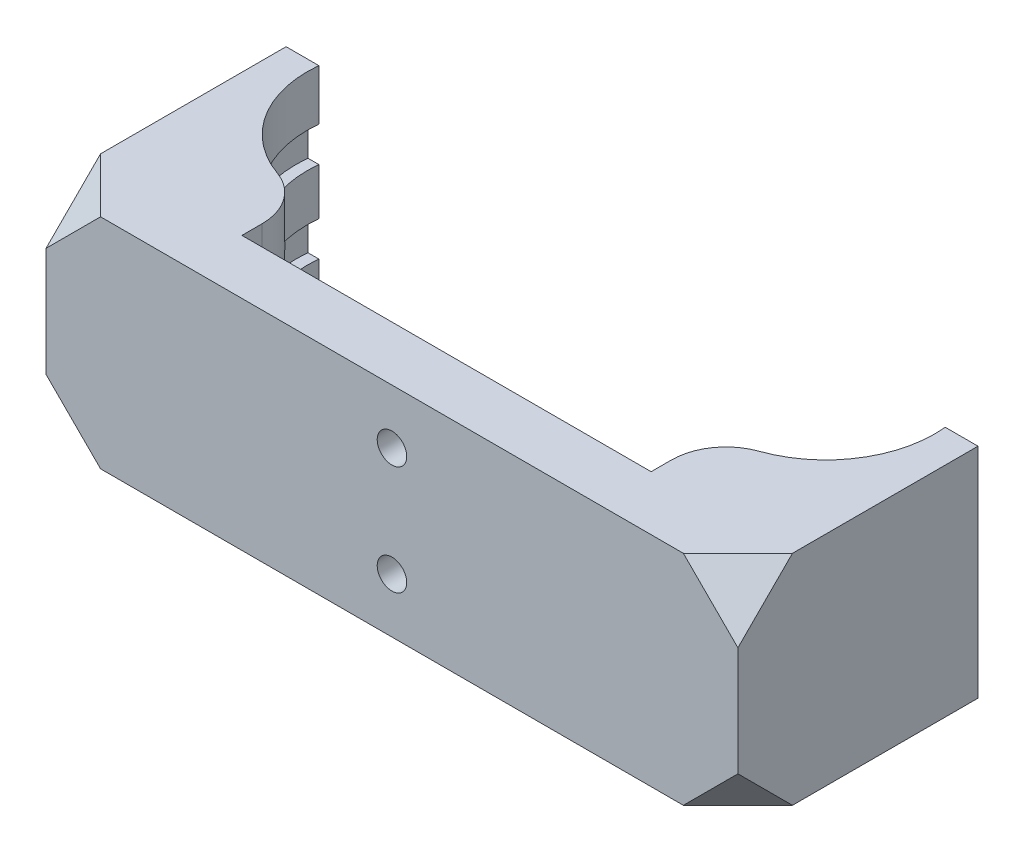
ISO-10303-21;
HEADER;
FILE_DESCRIPTION(('STEP AP214'),'2;1');
FILE_NAME('part.step','',(''),(''),'','','');
FILE_SCHEMA(('AUTOMOTIVE_DESIGN { 1 0 10303 214 1 1 1 1 }'));
ENDSEC;
DATA;
#1=APPLICATION_CONTEXT('core data for automotive mechanical design processes');
#2=APPLICATION_PROTOCOL_DEFINITION('international standard','automotive_design',2000,#1);
#3=PRODUCT_CONTEXT('',#1,'mechanical');
#4=PRODUCT('Part','Part','',(#3));
#5=PRODUCT_RELATED_PRODUCT_CATEGORY('part','',(#4));
#6=PRODUCT_DEFINITION_FORMATION('','',#4);
#7=PRODUCT_DEFINITION_CONTEXT('part definition',#1,'design');
#8=PRODUCT_DEFINITION('design','',#6,#7);
#9=PRODUCT_DEFINITION_SHAPE('','',#8);
#10=(LENGTH_UNIT() NAMED_UNIT(*) SI_UNIT(.MILLI.,.METRE.));
#11=(NAMED_UNIT(*) PLANE_ANGLE_UNIT() SI_UNIT($,.RADIAN.));
#12=(NAMED_UNIT(*) SI_UNIT($,.STERADIAN.) SOLID_ANGLE_UNIT());
#13=UNCERTAINTY_MEASURE_WITH_UNIT(LENGTH_MEASURE(1.E-05),#10,'distance_accuracy_value','');
#14=(GEOMETRIC_REPRESENTATION_CONTEXT(3) GLOBAL_UNCERTAINTY_ASSIGNED_CONTEXT((#13)) GLOBAL_UNIT_ASSIGNED_CONTEXT((#10,
#11,#12)) REPRESENTATION_CONTEXT('',''));
#15=CARTESIAN_POINT('',(0.,0.,0.));
#16=DIRECTION('',(0.,0.,1.));
#17=DIRECTION('',(1.,0.,0.));
#18=AXIS2_PLACEMENT_3D('',#15,#16,#17);
#19=CARTESIAN_POINT('',(-18.75,-10.,-16.));
#20=DIRECTION('',(0.,-1.,0.));
#21=DIRECTION('',(0.,0.,-1.));
#22=AXIS2_PLACEMENT_3D('',#19,#20,#21);
#23=PLANE('',#22);
#24=CARTESIAN_POINT('',(-18.75,-10.,-16.));
#25=DIRECTION('',(0.,-1.,0.));
#26=DIRECTION('',(0.,0.,-1.));
#27=AXIS2_PLACEMENT_3D('',#24,#25,#26);
#28=CIRCLE('',#27,10.);
#29=CARTESIAN_POINT('',(-22.0833333333333,-10.,-6.57190958417936));
#30=VERTEX_POINT('',#29);
#31=CARTESIAN_POINT('',(-28.6998743710662,-10.,-17.));
#32=VERTEX_POINT('',#31);
#33=EDGE_CURVE('E367',#30,#32,#28,.T.);
#34=ORIENTED_EDGE('',*,*,#33,.F.);
#35=CARTESIAN_POINT('',(-23.75,-10.,-1.85786437626904));
#36=DIRECTION('',(0.,-1.,0.));
#37=DIRECTION('',(0.,0.,-1.));
#38=AXIS2_PLACEMENT_3D('',#35,#36,#37);
#39=CIRCLE('',#38,5.);
#40=CARTESIAN_POINT('',(-18.75,-10.,-1.85786437626904));
#41=VERTEX_POINT('',#40);
#42=EDGE_CURVE('E299',#30,#41,#39,.T.);
#43=ORIENTED_EDGE('',*,*,#42,.T.);
#44=DIRECTION('',(0.,0.,-1.));
#45=VECTOR('',#44,1.);
#46=CARTESIAN_POINT('',(-18.75,-10.,0.));
#47=LINE('',#46,#45);
#48=CARTESIAN_POINT('',(-18.75,-10.,0.));
#49=VERTEX_POINT('',#48);
#50=EDGE_CURVE('E388',#49,#41,#47,.T.);
#51=ORIENTED_EDGE('',*,*,#50,.F.);
#52=DIRECTION('',(-1.,0.,0.));
#53=VECTOR('',#52,1.);
#54=CARTESIAN_POINT('',(-18.75,-10.,0.));
#55=LINE('',#54,#53);
#56=CARTESIAN_POINT('',(18.75,-10.,0.));
#57=VERTEX_POINT('',#56);
#58=EDGE_CURVE('E386',#57,#49,#55,.T.);
#59=ORIENTED_EDGE('',*,*,#58,.F.);
#60=DIRECTION('',(0.,0.,1.));
#61=VECTOR('',#60,1.);
#62=CARTESIAN_POINT('',(18.75,-10.,0.));
#63=LINE('',#62,#61);
#64=CARTESIAN_POINT('',(18.75,-10.,-1.85786437626905));
#65=VERTEX_POINT('',#64);
#66=EDGE_CURVE('E384',#65,#57,#63,.T.);
#67=ORIENTED_EDGE('',*,*,#66,.F.);
#68=CARTESIAN_POINT('',(23.75,-10.,-1.85786437626905));
#69=DIRECTION('',(0.,-1.,0.));
#70=DIRECTION('',(0.,0.,-1.));
#71=AXIS2_PLACEMENT_3D('',#68,#69,#70);
#72=CIRCLE('',#71,5.);
#73=CARTESIAN_POINT('',(22.0833333333333,-10.,-6.57190958417937));
#74=VERTEX_POINT('',#73);
#75=EDGE_CURVE('E297',#65,#74,#72,.T.);
#76=ORIENTED_EDGE('',*,*,#75,.T.);
#77=CARTESIAN_POINT('',(18.75,-10.,-16.));
#78=DIRECTION('',(0.,-1.,0.));
#79=DIRECTION('',(0.,0.,1.));
#80=AXIS2_PLACEMENT_3D('',#77,#78,#79);
#81=CIRCLE('',#80,10.);
#82=CARTESIAN_POINT('',(28.6998743710662,-10.,-17.));
#83=VERTEX_POINT('',#82);
#84=EDGE_CURVE('E381',#83,#74,#81,.T.);
#85=ORIENTED_EDGE('',*,*,#84,.F.);
#86=DIRECTION('',(-1.,0.,0.));
#87=VECTOR('',#86,1.);
#88=CARTESIAN_POINT('',(28.6998743710662,-10.,-17.));
#89=LINE('',#88,#87);
#90=CARTESIAN_POINT('',(31.6998743710662,-10.,-17.));
#91=VERTEX_POINT('',#90);
#92=EDGE_CURVE('E378',#91,#83,#89,.T.);
#93=ORIENTED_EDGE('',*,*,#92,.F.);
#94=DIRECTION('',(0.,0.,-1.));
#95=VECTOR('',#94,1.);
#96=CARTESIAN_POINT('',(31.6998743710662,-10.,-17.));
#97=LINE('',#96,#95);
#98=CARTESIAN_POINT('',(31.6998743710662,-10.,0.));
#99=VERTEX_POINT('',#98);
#100=EDGE_CURVE('E376',#99,#91,#97,.T.);
#101=ORIENTED_EDGE('',*,*,#100,.F.);
#102=DIRECTION('',(-0.707106781186547,0.,0.707106781186548));
#103=VECTOR('',#102,1.);
#104=CARTESIAN_POINT('',(14.4749371855331,-10.,17.2249371855331));
#105=LINE('',#104,#103);
#106=CARTESIAN_POINT('',(26.6998743710662,-10.,5.));
#107=VERTEX_POINT('',#106);
#108=EDGE_CURVE('E272',#99,#107,#105,.T.);
#109=ORIENTED_EDGE('',*,*,#108,.T.);
#110=DIRECTION('',(1.,0.,0.));
#111=VECTOR('',#110,1.);
#112=CARTESIAN_POINT('',(31.6998743710662,-10.,5.));
#113=LINE('',#112,#111);
#114=CARTESIAN_POINT('',(-26.6998743710662,-10.,5.00000000000001));
#115=VERTEX_POINT('',#114);
#116=EDGE_CURVE('E269',#115,#107,#113,.T.);
#117=ORIENTED_EDGE('',*,*,#116,.F.);
#118=DIRECTION('',(-0.707106781186547,0.,-0.707106781186548));
#119=VECTOR('',#118,1.);
#120=CARTESIAN_POINT('',(-33.2249371855331,-10.,-1.5250628144669));
#121=LINE('',#120,#119);
#122=CARTESIAN_POINT('',(-31.6998743710662,-10.,0.));
#123=VERTEX_POINT('',#122);
#124=EDGE_CURVE('E441',#115,#123,#121,.T.);
#125=ORIENTED_EDGE('',*,*,#124,.T.);
#126=DIRECTION('',(0.,0.,1.));
#127=VECTOR('',#126,1.);
#128=CARTESIAN_POINT('',(-31.6998743710662,-10.,-17.));
#129=LINE('',#128,#127);
#130=CARTESIAN_POINT('',(-31.6998743710662,-10.,-17.));
#131=VERTEX_POINT('',#130);
#132=EDGE_CURVE('E372',#131,#123,#129,.T.);
#133=ORIENTED_EDGE('',*,*,#132,.F.);
#134=DIRECTION('',(-1.,0.,0.));
#135=VECTOR('',#134,1.);
#136=CARTESIAN_POINT('',(-28.6998743710662,-10.,-17.));
#137=LINE('',#136,#135);
#138=EDGE_CURVE('E369',#32,#131,#137,.T.);
#139=ORIENTED_EDGE('',*,*,#138,.F.);
#140=EDGE_LOOP('',(#34,#43,#51,#59,#67,#76,#85,#93,#101,#109,#117,#125,#133,#139));
#141=FACE_BOUND('',#140,.T.);
#142=ADVANCED_FACE('F39',(#141),#23,.T.);
#143=CARTESIAN_POINT('',(28.6998743710662,10.,-17.));
#144=DIRECTION('',(0.,0.,1.));
#145=DIRECTION('',(1.,0.,0.));
#146=AXIS2_PLACEMENT_3D('',#143,#144,#145);
#147=PLANE('',#146);
#148=DIRECTION('',(1.,0.,0.));
#149=VECTOR('',#148,1.);
#150=CARTESIAN_POINT('',(29.7044511501033,-2.15,-17.));
#151=LINE('',#150,#149);
#152=CARTESIAN_POINT('',(28.6998743710662,-2.15,-17.));
#153=VERTEX_POINT('',#152);
#154=CARTESIAN_POINT('',(29.7044511501033,-2.15,-17.));
#155=VERTEX_POINT('',#154);
#156=EDGE_CURVE('E569',#153,#155,#151,.T.);
#157=ORIENTED_EDGE('',*,*,#156,.F.);
#158=DIRECTION('',(0.,-1.,0.));
#159=VECTOR('',#158,1.);
#160=CARTESIAN_POINT('',(28.6998743710662,10.,-17.));
#161=LINE('',#160,#159);
#162=CARTESIAN_POINT('',(28.6998743710662,2.15,-17.));
#163=VERTEX_POINT('',#162);
#164=EDGE_CURVE('E400',#163,#153,#161,.T.);
#165=ORIENTED_EDGE('',*,*,#164,.F.);
#166=DIRECTION('',(1.,0.,0.));
#167=VECTOR('',#166,1.);
#168=CARTESIAN_POINT('',(29.7044511501033,2.15,-17.));
#169=LINE('',#168,#167);
#170=CARTESIAN_POINT('',(29.7044511501033,2.15,-17.));
#171=VERTEX_POINT('',#170);
#172=EDGE_CURVE('E336',#163,#171,#169,.T.);
#173=ORIENTED_EDGE('',*,*,#172,.T.);
#174=DIRECTION('',(0.,1.,0.));
#175=VECTOR('',#174,1.);
#176=CARTESIAN_POINT('',(29.7044511501033,2.15,-17.));
#177=LINE('',#176,#175);
#178=CARTESIAN_POINT('',(29.7044511501033,5.35,-17.));
#179=VERTEX_POINT('',#178);
#180=EDGE_CURVE('E335',#171,#179,#177,.T.);
#181=ORIENTED_EDGE('',*,*,#180,.T.);
#182=DIRECTION('',(1.,0.,0.));
#183=VECTOR('',#182,1.);
#184=CARTESIAN_POINT('',(29.7044511501033,5.35,-17.));
#185=LINE('',#184,#183);
#186=CARTESIAN_POINT('',(28.6998743710662,5.35,-17.));
#187=VERTEX_POINT('',#186);
#188=EDGE_CURVE('E453',#187,#179,#185,.T.);
#189=ORIENTED_EDGE('',*,*,#188,.F.);
#190=CARTESIAN_POINT('',(28.6998743710662,10.,-17.));
#191=VERTEX_POINT('',#190);
#192=EDGE_CURVE('E398',#191,#187,#161,.T.);
#193=ORIENTED_EDGE('',*,*,#192,.F.);
#194=DIRECTION('',(-1.,0.,0.));
#195=VECTOR('',#194,1.);
#196=CARTESIAN_POINT('',(28.6998743710662,10.,-17.));
#197=LINE('',#196,#195);
#198=CARTESIAN_POINT('',(31.6998743710662,10.,-17.));
#199=VERTEX_POINT('',#198);
#200=EDGE_CURVE('E353',#199,#191,#197,.T.);
#201=ORIENTED_EDGE('',*,*,#200,.F.);
#202=DIRECTION('',(0.,-1.,0.));
#203=VECTOR('',#202,1.);
#204=CARTESIAN_POINT('',(31.6998743710662,10.,-17.));
#205=LINE('',#204,#203);
#206=EDGE_CURVE('E260',#199,#91,#205,.T.);
#207=ORIENTED_EDGE('',*,*,#206,.T.);
#208=ORIENTED_EDGE('',*,*,#92,.T.);
#209=CARTESIAN_POINT('',(28.6998743710662,-5.35,-17.));
#210=VERTEX_POINT('',#209);
#211=EDGE_CURVE('E397',#210,#83,#161,.T.);
#212=ORIENTED_EDGE('',*,*,#211,.F.);
#213=DIRECTION('',(1.,0.,0.));
#214=VECTOR('',#213,1.);
#215=CARTESIAN_POINT('',(29.7044511501033,-5.35,-17.));
#216=LINE('',#215,#214);
#217=CARTESIAN_POINT('',(29.7044511501033,-5.35,-17.));
#218=VERTEX_POINT('',#217);
#219=EDGE_CURVE('E562',#210,#218,#216,.T.);
#220=ORIENTED_EDGE('',*,*,#219,.T.);
#221=DIRECTION('',(0.,-1.,0.));
#222=VECTOR('',#221,1.);
#223=CARTESIAN_POINT('',(29.7044511501033,-2.15,-17.));
#224=LINE('',#223,#222);
#225=EDGE_CURVE('E457',#155,#218,#224,.T.);
#226=ORIENTED_EDGE('',*,*,#225,.F.);
#227=EDGE_LOOP('',(#157,#165,#173,#181,#189,#193,#201,#207,#208,#212,#220,#226));
#228=FACE_BOUND('',#227,.T.);
#229=ADVANCED_FACE('F450',(#228),#147,.F.);
#230=CARTESIAN_POINT('',(18.75,10.,-16.));
#231=DIRECTION('',(0.,-1.,0.));
#232=DIRECTION('',(0.,0.,-1.));
#233=AXIS2_PLACEMENT_3D('',#230,#231,#232);
#234=CYLINDRICAL_SURFACE('',#233,10.);
#235=CARTESIAN_POINT('',(18.75,-2.15,-16.));
#236=DIRECTION('',(0.,1.,0.));
#237=DIRECTION('',(0.,0.,1.));
#238=AXIS2_PLACEMENT_3D('',#235,#236,#237);
#239=CIRCLE('',#238,10.);
#240=CARTESIAN_POINT('',(22.0833333333333,-2.15,-6.57190958417936));
#241=VERTEX_POINT('',#240);
#242=EDGE_CURVE('E583',#241,#153,#239,.T.);
#243=ORIENTED_EDGE('',*,*,#242,.F.);
#244=DIRECTION('',(0.,-1.,0.));
#245=VECTOR('',#244,1.);
#246=CARTESIAN_POINT('',(22.0833333333333,0.,-6.57190958417937));
#247=LINE('',#246,#245);
#248=CARTESIAN_POINT('',(22.0833333333333,2.15,-6.57190958417936));
#249=VERTEX_POINT('',#248);
#250=EDGE_CURVE('E318',#241,#249,#247,.F.);
#251=ORIENTED_EDGE('',*,*,#250,.T.);
#252=CARTESIAN_POINT('',(18.75,2.15,-16.));
#253=DIRECTION('',(0.,1.,0.));
#254=DIRECTION('',(0.,0.,1.));
#255=AXIS2_PLACEMENT_3D('',#252,#253,#254);
#256=CIRCLE('',#255,10.);
#257=EDGE_CURVE('E330',#249,#163,#256,.T.);
#258=ORIENTED_EDGE('',*,*,#257,.T.);
#259=ORIENTED_EDGE('',*,*,#164,.T.);
#260=EDGE_LOOP('',(#243,#251,#258,#259));
#261=FACE_BOUND('',#260,.T.);
#262=ADVANCED_FACE('F574',(#261),#234,.F.);
#263=CARTESIAN_POINT('',(18.75,10.,0.));
#264=DIRECTION('',(1.,0.,0.));
#265=DIRECTION('',(0.,0.,-1.));
#266=AXIS2_PLACEMENT_3D('',#263,#264,#265);
#267=PLANE('',#266);
#268=DIRECTION('',(0.,0.,1.));
#269=VECTOR('',#268,1.);
#270=CARTESIAN_POINT('',(18.75,10.,0.));
#271=LINE('',#270,#269);
#272=CARTESIAN_POINT('',(18.75,10.,-1.85786437626905));
#273=VERTEX_POINT('',#272);
#274=CARTESIAN_POINT('',(18.75,10.,0.));
#275=VERTEX_POINT('',#274);
#276=EDGE_CURVE('E355',#273,#275,#271,.T.);
#277=ORIENTED_EDGE('',*,*,#276,.F.);
#278=DIRECTION('',(0.,-1.,0.));
#279=VECTOR('',#278,1.);
#280=CARTESIAN_POINT('',(18.75,10.,-1.85786437626905));
#281=LINE('',#280,#279);
#282=EDGE_CURVE('E307',#273,#65,#281,.T.);
#283=ORIENTED_EDGE('',*,*,#282,.T.);
#284=ORIENTED_EDGE('',*,*,#66,.T.);
#285=DIRECTION('',(0.,-1.,0.));
#286=VECTOR('',#285,1.);
#287=CARTESIAN_POINT('',(18.75,10.,0.));
#288=LINE('',#287,#286);
#289=EDGE_CURVE('E394',#275,#57,#288,.T.);
#290=ORIENTED_EDGE('',*,*,#289,.F.);
#291=EDGE_LOOP('',(#277,#283,#284,#290));
#292=FACE_BOUND('',#291,.T.);
#293=ADVANCED_FACE('F548',(#292),#267,.F.);
#294=ORIENTED_EDGE('',*,*,#84,.T.);
#295=DIRECTION('',(0.,-1.,0.));
#296=VECTOR('',#295,1.);
#297=CARTESIAN_POINT('',(22.0833333333333,-7.675,-6.57190958417937));
#298=LINE('',#297,#296);
#299=CARTESIAN_POINT('',(22.0833333333333,-5.35,-6.57190958417936));
#300=VERTEX_POINT('',#299);
#301=EDGE_CURVE('E310',#74,#300,#298,.F.);
#302=ORIENTED_EDGE('',*,*,#301,.T.);
#303=CARTESIAN_POINT('',(18.75,-5.35,-16.));
#304=DIRECTION('',(0.,1.,0.));
#305=DIRECTION('',(0.,0.,1.));
#306=AXIS2_PLACEMENT_3D('',#303,#304,#305);
#307=CIRCLE('',#306,10.);
#308=EDGE_CURVE('E555',#300,#210,#307,.T.);
#309=ORIENTED_EDGE('',*,*,#308,.T.);
#310=ORIENTED_EDGE('',*,*,#211,.T.);
#311=EDGE_LOOP('',(#294,#302,#309,#310));
#312=FACE_BOUND('',#311,.T.);
#313=ADVANCED_FACE('F554',(#312),#234,.F.);
#314=CARTESIAN_POINT('',(-18.75,10.,-16.));
#315=DIRECTION('',(0.,-1.,0.));
#316=DIRECTION('',(0.,0.,-1.));
#317=AXIS2_PLACEMENT_3D('',#314,#315,#316);
#318=CYLINDRICAL_SURFACE('',#317,10.);
#319=CARTESIAN_POINT('',(-18.75,2.15,-16.));
#320=DIRECTION('',(0.,-1.,0.));
#321=DIRECTION('',(0.,0.,1.));
#322=AXIS2_PLACEMENT_3D('',#319,#320,#321);
#323=CIRCLE('',#322,10.);
#324=CARTESIAN_POINT('',(-22.0833333333333,2.15,-6.57190958417936));
#325=VERTEX_POINT('',#324);
#326=CARTESIAN_POINT('',(-28.6998743710662,2.15,-17.));
#327=VERTEX_POINT('',#326);
#328=EDGE_CURVE('E484',#325,#327,#323,.T.);
#329=ORIENTED_EDGE('',*,*,#328,.F.);
#330=DIRECTION('',(0.,-1.,0.));
#331=VECTOR('',#330,1.);
#332=CARTESIAN_POINT('',(-22.0833333333333,0.,-6.57190958417936));
#333=LINE('',#332,#331);
#334=CARTESIAN_POINT('',(-22.0833333333333,-2.15,-6.57190958417936));
#335=VERTEX_POINT('',#334);
#336=EDGE_CURVE('E287',#325,#335,#333,.T.);
#337=ORIENTED_EDGE('',*,*,#336,.T.);
#338=CARTESIAN_POINT('',(-18.75,-2.15,-16.));
#339=DIRECTION('',(0.,-1.,0.));
#340=DIRECTION('',(0.,0.,1.));
#341=AXIS2_PLACEMENT_3D('',#338,#339,#340);
#342=CIRCLE('',#341,10.);
#343=CARTESIAN_POINT('',(-28.6998743710662,-2.15,-17.));
#344=VERTEX_POINT('',#343);
#345=EDGE_CURVE('E470',#335,#344,#342,.T.);
#346=ORIENTED_EDGE('',*,*,#345,.T.);
#347=DIRECTION('',(0.,-1.,0.));
#348=VECTOR('',#347,1.);
#349=CARTESIAN_POINT('',(-28.6998743710662,10.,-17.));
#350=LINE('',#349,#348);
#351=EDGE_CURVE('E413',#327,#344,#350,.T.);
#352=ORIENTED_EDGE('',*,*,#351,.F.);
#353=EDGE_LOOP('',(#329,#337,#346,#352));
#354=FACE_BOUND('',#353,.T.);
#355=ADVANCED_FACE('F635',(#354),#318,.F.);
#356=CARTESIAN_POINT('',(-28.6998743710662,10.,-17.));
#357=DIRECTION('',(0.,0.,1.));
#358=DIRECTION('',(1.,0.,0.));
#359=AXIS2_PLACEMENT_3D('',#356,#357,#358);
#360=PLANE('',#359);
#361=DIRECTION('',(-1.,0.,0.));
#362=VECTOR('',#361,1.);
#363=CARTESIAN_POINT('',(-29.7044511501033,-2.15,-17.));
#364=LINE('',#363,#362);
#365=CARTESIAN_POINT('',(-29.7044511501033,-2.15,-17.));
#366=VERTEX_POINT('',#365);
#367=EDGE_CURVE('E466',#344,#366,#364,.T.);
#368=ORIENTED_EDGE('',*,*,#367,.T.);
#369=DIRECTION('',(0.,-1.,0.));
#370=VECTOR('',#369,1.);
#371=CARTESIAN_POINT('',(-29.7044511501033,-2.15,-17.));
#372=LINE('',#371,#370);
#373=CARTESIAN_POINT('',(-29.7044511501033,-5.35,-17.));
#374=VERTEX_POINT('',#373);
#375=EDGE_CURVE('E472',#366,#374,#372,.T.);
#376=ORIENTED_EDGE('',*,*,#375,.T.);
#377=DIRECTION('',(-1.,0.,0.));
#378=VECTOR('',#377,1.);
#379=CARTESIAN_POINT('',(-29.7044511501033,-5.35,-17.));
#380=LINE('',#379,#378);
#381=CARTESIAN_POINT('',(-28.6998743710662,-5.35,-17.));
#382=VERTEX_POINT('',#381);
#383=EDGE_CURVE('E475',#382,#374,#380,.T.);
#384=ORIENTED_EDGE('',*,*,#383,.F.);
#385=EDGE_CURVE('E408',#382,#32,#350,.T.);
#386=ORIENTED_EDGE('',*,*,#385,.T.);
#387=ORIENTED_EDGE('',*,*,#138,.T.);
#388=DIRECTION('',(0.,-1.,0.));
#389=VECTOR('',#388,1.);
#390=CARTESIAN_POINT('',(-31.6998743710662,10.,-17.));
#391=LINE('',#390,#389);
#392=CARTESIAN_POINT('',(-31.6998743710662,10.,-17.));
#393=VERTEX_POINT('',#392);
#394=EDGE_CURVE('E405',#393,#131,#391,.T.);
#395=ORIENTED_EDGE('',*,*,#394,.F.);
#396=DIRECTION('',(-1.,0.,0.));
#397=VECTOR('',#396,1.);
#398=CARTESIAN_POINT('',(-28.6998743710662,10.,-17.));
#399=LINE('',#398,#397);
#400=CARTESIAN_POINT('',(-28.6998743710662,10.,-17.));
#401=VERTEX_POINT('',#400);
#402=EDGE_CURVE('E498',#401,#393,#399,.T.);
#403=ORIENTED_EDGE('',*,*,#402,.F.);
#404=CARTESIAN_POINT('',(-28.6998743710662,5.35,-17.));
#405=VERTEX_POINT('',#404);
#406=EDGE_CURVE('E409',#401,#405,#350,.T.);
#407=ORIENTED_EDGE('',*,*,#406,.T.);
#408=DIRECTION('',(-1.,0.,0.));
#409=VECTOR('',#408,1.);
#410=CARTESIAN_POINT('',(-29.7044511501033,5.35,-17.));
#411=LINE('',#410,#409);
#412=CARTESIAN_POINT('',(-29.7044511501033,5.35,-17.));
#413=VERTEX_POINT('',#412);
#414=EDGE_CURVE('E485',#405,#413,#411,.T.);
#415=ORIENTED_EDGE('',*,*,#414,.T.);
#416=DIRECTION('',(0.,1.,0.));
#417=VECTOR('',#416,1.);
#418=CARTESIAN_POINT('',(-29.7044511501033,2.15,-17.));
#419=LINE('',#418,#417);
#420=CARTESIAN_POINT('',(-29.7044511501033,2.15,-17.));
#421=VERTEX_POINT('',#420);
#422=EDGE_CURVE('E370',#421,#413,#419,.T.);
#423=ORIENTED_EDGE('',*,*,#422,.F.);
#424=DIRECTION('',(-1.,0.,0.));
#425=VECTOR('',#424,1.);
#426=CARTESIAN_POINT('',(-29.7044511501033,2.15,-17.));
#427=LINE('',#426,#425);
#428=EDGE_CURVE('E487',#327,#421,#427,.T.);
#429=ORIENTED_EDGE('',*,*,#428,.F.);
#430=ORIENTED_EDGE('',*,*,#351,.T.);
#431=EDGE_LOOP('',(#368,#376,#384,#386,#387,#395,#403,#407,#415,#423,#429,#430));
#432=FACE_BOUND('',#431,.T.);
#433=ADVANCED_FACE('F521',(#432),#360,.F.);
#434=CARTESIAN_POINT('',(-18.75,10.,0.));
#435=DIRECTION('',(-1.,0.,0.));
#436=DIRECTION('',(0.,0.,1.));
#437=AXIS2_PLACEMENT_3D('',#434,#435,#436);
#438=PLANE('',#437);
#439=ORIENTED_EDGE('',*,*,#50,.T.);
#440=DIRECTION('',(0.,-1.,0.));
#441=VECTOR('',#440,1.);
#442=CARTESIAN_POINT('',(-18.75,10.,-1.85786437626904));
#443=LINE('',#442,#441);
#444=CARTESIAN_POINT('',(-18.75,10.,-1.85786437626904));
#445=VERTEX_POINT('',#444);
#446=EDGE_CURVE('E301',#41,#445,#443,.F.);
#447=ORIENTED_EDGE('',*,*,#446,.T.);
#448=DIRECTION('',(0.,0.,-1.));
#449=VECTOR('',#448,1.);
#450=CARTESIAN_POINT('',(-18.75,10.,0.));
#451=LINE('',#450,#449);
#452=CARTESIAN_POINT('',(-18.75,10.,0.));
#453=VERTEX_POINT('',#452);
#454=EDGE_CURVE('E364',#453,#445,#451,.T.);
#455=ORIENTED_EDGE('',*,*,#454,.F.);
#456=DIRECTION('',(0.,-1.,0.));
#457=VECTOR('',#456,1.);
#458=CARTESIAN_POINT('',(-18.75,10.,0.));
#459=LINE('',#458,#457);
#460=EDGE_CURVE('E366',#453,#49,#459,.T.);
#461=ORIENTED_EDGE('',*,*,#460,.T.);
#462=EDGE_LOOP('',(#439,#447,#455,#461));
#463=FACE_BOUND('',#462,.T.);
#464=ADVANCED_FACE('F538',(#463),#438,.F.);
#465=CARTESIAN_POINT('',(-18.75,-5.35,-16.));
#466=DIRECTION('',(0.,-1.,0.));
#467=DIRECTION('',(0.,0.,1.));
#468=AXIS2_PLACEMENT_3D('',#465,#466,#467);
#469=CIRCLE('',#468,10.);
#470=CARTESIAN_POINT('',(-22.0833333333333,-5.35,-6.57190958417936));
#471=VERTEX_POINT('',#470);
#472=EDGE_CURVE('E467',#471,#382,#469,.T.);
#473=ORIENTED_EDGE('',*,*,#472,.F.);
#474=DIRECTION('',(0.,-1.,0.));
#475=VECTOR('',#474,1.);
#476=CARTESIAN_POINT('',(-22.0833333333333,-7.675,-6.57190958417936));
#477=LINE('',#476,#475);
#478=EDGE_CURVE('E295',#471,#30,#477,.T.);
#479=ORIENTED_EDGE('',*,*,#478,.T.);
#480=ORIENTED_EDGE('',*,*,#33,.T.);
#481=ORIENTED_EDGE('',*,*,#385,.F.);
#482=EDGE_LOOP('',(#473,#479,#480,#481));
#483=FACE_BOUND('',#482,.T.);
#484=ADVANCED_FACE('F628',(#483),#318,.F.);
#485=CARTESIAN_POINT('',(-18.75,10.,-16.));
#486=DIRECTION('',(0.,-1.,0.));
#487=DIRECTION('',(0.,0.,-1.));
#488=AXIS2_PLACEMENT_3D('',#485,#486,#487);
#489=CIRCLE('',#488,10.);
#490=CARTESIAN_POINT('',(-22.0833333333333,10.,-6.57190958417936));
#491=VERTEX_POINT('',#490);
#492=EDGE_CURVE('E391',#491,#401,#489,.T.);
#493=ORIENTED_EDGE('',*,*,#492,.F.);
#494=DIRECTION('',(0.,-1.,0.));
#495=VECTOR('',#494,1.);
#496=CARTESIAN_POINT('',(-22.0833333333333,10.,-6.57190958417936));
#497=LINE('',#496,#495);
#498=CARTESIAN_POINT('',(-22.0833333333333,5.35,-6.57190958417936));
#499=VERTEX_POINT('',#498);
#500=EDGE_CURVE('E275',#491,#499,#497,.T.);
#501=ORIENTED_EDGE('',*,*,#500,.T.);
#502=CARTESIAN_POINT('',(-18.75,5.35,-16.));
#503=DIRECTION('',(0.,-1.,0.));
#504=DIRECTION('',(0.,0.,1.));
#505=AXIS2_PLACEMENT_3D('',#502,#503,#504);
#506=CIRCLE('',#505,10.);
#507=EDGE_CURVE('E492',#499,#405,#506,.T.);
#508=ORIENTED_EDGE('',*,*,#507,.T.);
#509=ORIENTED_EDGE('',*,*,#406,.F.);
#510=EDGE_LOOP('',(#493,#501,#508,#509));
#511=FACE_BOUND('',#510,.T.);
#512=ADVANCED_FACE('F633',(#511),#318,.F.);
#513=CARTESIAN_POINT('',(-31.6998743710662,10.,-17.));
#514=DIRECTION('',(1.,0.,0.));
#515=DIRECTION('',(0.,0.,-1.));
#516=AXIS2_PLACEMENT_3D('',#513,#514,#515);
#517=PLANE('',#516);
#518=DIRECTION('',(0.,-0.707106781186547,-0.707106781186547));
#519=VECTOR('',#518,1.);
#520=CARTESIAN_POINT('',(-31.6998743710662,-8.49999999999999,1.5));
#521=LINE('',#520,#519);
#522=CARTESIAN_POINT('',(-31.6998743710662,-4.99999999999999,5.00000000000001));
#523=VERTEX_POINT('',#522);
#524=EDGE_CURVE('E437',#523,#123,#521,.T.);
#525=ORIENTED_EDGE('',*,*,#524,.F.);
#526=DIRECTION('',(0.,-1.,0.));
#527=VECTOR('',#526,1.);
#528=CARTESIAN_POINT('',(-31.6998743710662,10.,5.00000000000001));
#529=LINE('',#528,#527);
#530=CARTESIAN_POINT('',(-31.6998743710662,5.00000000000001,5.00000000000001));
#531=VERTEX_POINT('',#530);
#532=EDGE_CURVE('E259',#531,#523,#529,.T.);
#533=ORIENTED_EDGE('',*,*,#532,.F.);
#534=DIRECTION('',(0.,-0.707106781186548,0.707106781186548));
#535=VECTOR('',#534,1.);
#536=CARTESIAN_POINT('',(-31.6998743710662,18.5,-8.49999999999999));
#537=LINE('',#536,#535);
#538=CARTESIAN_POINT('',(-31.6998743710662,10.,0.));
#539=VERTEX_POINT('',#538);
#540=EDGE_CURVE('E428',#539,#531,#537,.T.);
#541=ORIENTED_EDGE('',*,*,#540,.F.);
#542=DIRECTION('',(0.,0.,1.));
#543=VECTOR('',#542,1.);
#544=CARTESIAN_POINT('',(-31.6998743710662,10.,-17.));
#545=LINE('',#544,#543);
#546=EDGE_CURVE('E500',#393,#539,#545,.T.);
#547=ORIENTED_EDGE('',*,*,#546,.F.);
#548=ORIENTED_EDGE('',*,*,#394,.T.);
#549=ORIENTED_EDGE('',*,*,#132,.T.);
#550=EDGE_LOOP('',(#525,#533,#541,#547,#548,#549));
#551=FACE_BOUND('',#550,.T.);
#552=ADVANCED_FACE('F513',(#551),#517,.F.);
#553=CARTESIAN_POINT('',(31.6998743710662,10.,5.));
#554=DIRECTION('',(0.,0.,-1.));
#555=DIRECTION('',(-1.,0.,0.));
#556=AXIS2_PLACEMENT_3D('',#553,#554,#555);
#557=PLANE('',#556);
#558=DIRECTION('',(-0.707106781186547,-0.707106781186548,0.));
#559=VECTOR('',#558,1.);
#560=CARTESIAN_POINT('',(39.1998743710662,2.50000000000001,5.));
#561=LINE('',#560,#559);
#562=CARTESIAN_POINT('',(31.6998743710662,-4.99999999999999,5.));
#563=VERTEX_POINT('',#562);
#564=EDGE_CURVE('E264',#563,#107,#561,.T.);
#565=ORIENTED_EDGE('',*,*,#564,.F.);
#566=DIRECTION('',(0.,-1.,0.));
#567=VECTOR('',#566,1.);
#568=CARTESIAN_POINT('',(31.6998743710662,10.,5.));
#569=LINE('',#568,#567);
#570=CARTESIAN_POINT('',(31.6998743710662,4.99999999999999,5.));
#571=VERTEX_POINT('',#570);
#572=EDGE_CURVE('E247',#571,#563,#569,.T.);
#573=ORIENTED_EDGE('',*,*,#572,.F.);
#574=DIRECTION('',(0.707106781186547,-0.707106781186548,0.));
#575=VECTOR('',#574,1.);
#576=CARTESIAN_POINT('',(29.1998743710662,7.5,5.));
#577=LINE('',#576,#575);
#578=CARTESIAN_POINT('',(26.6998743710662,10.,5.00000000000001));
#579=VERTEX_POINT('',#578);
#580=EDGE_CURVE('E412',#579,#571,#577,.T.);
#581=ORIENTED_EDGE('',*,*,#580,.F.);
#582=DIRECTION('',(1.,0.,0.));
#583=VECTOR('',#582,1.);
#584=CARTESIAN_POINT('',(31.6998743710662,10.,5.));
#585=LINE('',#584,#583);
#586=CARTESIAN_POINT('',(-26.6998743710662,10.,5.00000000000001));
#587=VERTEX_POINT('',#586);
#588=EDGE_CURVE('E502',#587,#579,#585,.T.);
#589=ORIENTED_EDGE('',*,*,#588,.F.);
#590=DIRECTION('',(0.707106781186547,0.707106781186548,0.));
#591=VECTOR('',#590,1.);
#592=CARTESIAN_POINT('',(2.49999999999999,39.1998743710662,5.));
#593=LINE('',#592,#591);
#594=EDGE_CURVE('E431',#531,#587,#593,.T.);
#595=ORIENTED_EDGE('',*,*,#594,.F.);
#596=ORIENTED_EDGE('',*,*,#532,.T.);
#597=DIRECTION('',(-0.707106781186547,0.707106781186548,0.));
#598=VECTOR('',#597,1.);
#599=CARTESIAN_POINT('',(-7.50000000000001,-29.1998743710662,5.00000000000001));
#600=LINE('',#599,#598);
#601=EDGE_CURVE('E439',#115,#523,#600,.T.);
#602=ORIENTED_EDGE('',*,*,#601,.F.);
#603=ORIENTED_EDGE('',*,*,#116,.T.);
#604=EDGE_LOOP('',(#565,#573,#581,#589,#595,#596,#602,#603));
#605=FACE_BOUND('',#604,.T.);
#606=CARTESIAN_POINT('',(0.,-5.,5.00000000000001));
#607=DIRECTION('',(0.,0.,1.));
#608=DIRECTION('',(1.,0.,0.));
#609=AXIS2_PLACEMENT_3D('',#606,#607,#608);
#610=CIRCLE('',#609,1.34999999999999);
#611=CARTESIAN_POINT('',(1.34999999999999,-5.,5.00000000000001));
#612=VERTEX_POINT('',#611);
#613=EDGE_CURVE('E422',#612,#612,#610,.T.);
#614=ORIENTED_EDGE('',*,*,#613,.F.);
#615=EDGE_LOOP('',(#614));
#616=FACE_BOUND('',#615,.T.);
#617=CARTESIAN_POINT('',(0.,5.,5.00000000000001));
#618=DIRECTION('',(0.,0.,1.));
#619=DIRECTION('',(1.,0.,0.));
#620=AXIS2_PLACEMENT_3D('',#617,#618,#619);
#621=CIRCLE('',#620,1.34999999999999);
#622=CARTESIAN_POINT('',(1.34999999999999,5.,5.00000000000001));
#623=VERTEX_POINT('',#622);
#624=EDGE_CURVE('E418',#623,#623,#621,.T.);
#625=ORIENTED_EDGE('',*,*,#624,.F.);
#626=EDGE_LOOP('',(#625));
#627=FACE_BOUND('',#626,.T.);
#628=ADVANCED_FACE('F265',(#605,#616,#627),#557,.F.);
#629=CARTESIAN_POINT('',(31.6998743710662,10.,-17.));
#630=DIRECTION('',(-1.,0.,0.));
#631=DIRECTION('',(0.,0.,1.));
#632=AXIS2_PLACEMENT_3D('',#629,#630,#631);
#633=PLANE('',#632);
#634=DIRECTION('',(0.,0.707106781186548,0.707106781186547));
#635=VECTOR('',#634,1.);
#636=CARTESIAN_POINT('',(31.6998743710662,-8.49999999999999,1.49999999999999));
#637=LINE('',#636,#635);
#638=EDGE_CURVE('E251',#99,#563,#637,.T.);
#639=ORIENTED_EDGE('',*,*,#638,.F.);
#640=ORIENTED_EDGE('',*,*,#100,.T.);
#641=ORIENTED_EDGE('',*,*,#206,.F.);
#642=DIRECTION('',(0.,0.,-1.));
#643=VECTOR('',#642,1.);
#644=CARTESIAN_POINT('',(31.6998743710662,10.,-17.));
#645=LINE('',#644,#643);
#646=CARTESIAN_POINT('',(31.6998743710662,10.,0.));
#647=VERTEX_POINT('',#646);
#648=EDGE_CURVE('E359',#647,#199,#645,.T.);
#649=ORIENTED_EDGE('',*,*,#648,.F.);
#650=DIRECTION('',(0.,0.707106781186548,-0.707106781186547));
#651=VECTOR('',#650,1.);
#652=CARTESIAN_POINT('',(31.6998743710662,18.5,-8.5));
#653=LINE('',#652,#651);
#654=EDGE_CURVE('E255',#571,#647,#653,.T.);
#655=ORIENTED_EDGE('',*,*,#654,.F.);
#656=ORIENTED_EDGE('',*,*,#572,.T.);
#657=EDGE_LOOP('',(#639,#640,#641,#649,#655,#656));
#658=FACE_BOUND('',#657,.T.);
#659=ADVANCED_FACE('F249',(#658),#633,.F.);
#660=CARTESIAN_POINT('',(18.75,5.35,-16.));
#661=DIRECTION('',(0.,1.,0.));
#662=DIRECTION('',(0.,0.,1.));
#663=AXIS2_PLACEMENT_3D('',#660,#661,#662);
#664=CIRCLE('',#663,10.);
#665=CARTESIAN_POINT('',(22.0833333333333,5.35,-6.57190958417936));
#666=VERTEX_POINT('',#665);
#667=EDGE_CURVE('E337',#666,#187,#664,.T.);
#668=ORIENTED_EDGE('',*,*,#667,.F.);
#669=DIRECTION('',(0.,-1.,0.));
#670=VECTOR('',#669,1.);
#671=CARTESIAN_POINT('',(22.0833333333333,10.,-6.57190958417937));
#672=LINE('',#671,#670);
#673=CARTESIAN_POINT('',(22.0833333333333,10.,-6.57190958417937));
#674=VERTEX_POINT('',#673);
#675=EDGE_CURVE('E11',#666,#674,#672,.F.);
#676=ORIENTED_EDGE('',*,*,#675,.T.);
#677=CARTESIAN_POINT('',(18.75,10.,-16.));
#678=DIRECTION('',(0.,-1.,0.));
#679=DIRECTION('',(0.,0.,1.));
#680=AXIS2_PLACEMENT_3D('',#677,#678,#679);
#681=CIRCLE('',#680,10.);
#682=EDGE_CURVE('E347',#191,#674,#681,.T.);
#683=ORIENTED_EDGE('',*,*,#682,.F.);
#684=ORIENTED_EDGE('',*,*,#192,.T.);
#685=EDGE_LOOP('',(#668,#676,#683,#684));
#686=FACE_BOUND('',#685,.T.);
#687=ADVANCED_FACE('F345',(#686),#234,.F.);
#688=CARTESIAN_POINT('',(-18.75,10.,0.));
#689=DIRECTION('',(0.,0.,1.));
#690=DIRECTION('',(1.,0.,0.));
#691=AXIS2_PLACEMENT_3D('',#688,#689,#690);
#692=PLANE('',#691);
#693=CARTESIAN_POINT('',(0.,-5.,0.));
#694=DIRECTION('',(0.,0.,1.));
#695=DIRECTION('',(1.,0.,0.));
#696=AXIS2_PLACEMENT_3D('',#693,#694,#695);
#697=CIRCLE('',#696,1.34999999999999);
#698=CARTESIAN_POINT('',(1.34999999999999,-5.,0.));
#699=VERTEX_POINT('',#698);
#700=EDGE_CURVE('E419',#699,#699,#697,.T.);
#701=ORIENTED_EDGE('',*,*,#700,.T.);
#702=EDGE_LOOP('',(#701));
#703=FACE_BOUND('',#702,.T.);
#704=CARTESIAN_POINT('',(0.,5.,0.));
#705=DIRECTION('',(0.,0.,1.));
#706=DIRECTION('',(1.,0.,0.));
#707=AXIS2_PLACEMENT_3D('',#704,#705,#706);
#708=CIRCLE('',#707,1.34999999999999);
#709=CARTESIAN_POINT('',(1.34999999999999,5.,0.));
#710=VERTEX_POINT('',#709);
#711=EDGE_CURVE('E414',#710,#710,#708,.T.);
#712=ORIENTED_EDGE('',*,*,#711,.T.);
#713=EDGE_LOOP('',(#712));
#714=FACE_BOUND('',#713,.T.);
#715=ORIENTED_EDGE('',*,*,#58,.T.);
#716=ORIENTED_EDGE('',*,*,#460,.F.);
#717=DIRECTION('',(-1.,0.,0.));
#718=VECTOR('',#717,1.);
#719=CARTESIAN_POINT('',(-18.75,10.,0.));
#720=LINE('',#719,#718);
#721=EDGE_CURVE('E357',#275,#453,#720,.T.);
#722=ORIENTED_EDGE('',*,*,#721,.F.);
#723=ORIENTED_EDGE('',*,*,#289,.T.);
#724=EDGE_LOOP('',(#715,#716,#722,#723));
#725=FACE_BOUND('',#724,.T.);
#726=ADVANCED_FACE('F544',(#703,#714,#725),#692,.F.);
#727=CARTESIAN_POINT('',(-18.75,10.,-16.));
#728=DIRECTION('',(0.,-1.,0.));
#729=DIRECTION('',(0.,0.,-1.));
#730=AXIS2_PLACEMENT_3D('',#727,#728,#729);
#731=PLANE('',#730);
#732=ORIENTED_EDGE('',*,*,#454,.T.);
#733=CARTESIAN_POINT('',(-23.75,10.,-1.85786437626904));
#734=DIRECTION('',(0.,-1.,0.));
#735=DIRECTION('',(0.,0.,-1.));
#736=AXIS2_PLACEMENT_3D('',#733,#734,#735);
#737=CIRCLE('',#736,5.);
#738=EDGE_CURVE('E305',#445,#491,#737,.F.);
#739=ORIENTED_EDGE('',*,*,#738,.T.);
#740=ORIENTED_EDGE('',*,*,#492,.T.);
#741=ORIENTED_EDGE('',*,*,#402,.T.);
#742=ORIENTED_EDGE('',*,*,#546,.T.);
#743=DIRECTION('',(-0.707106781186548,0.,-0.707106781186548));
#744=VECTOR('',#743,1.);
#745=CARTESIAN_POINT('',(-33.2249371855331,10.,-1.5250628144669));
#746=LINE('',#745,#744);
#747=EDGE_CURVE('E434',#587,#539,#746,.T.);
#748=ORIENTED_EDGE('',*,*,#747,.F.);
#749=ORIENTED_EDGE('',*,*,#588,.T.);
#750=DIRECTION('',(-0.707106781186547,0.,0.707106781186548));
#751=VECTOR('',#750,1.);
#752=CARTESIAN_POINT('',(14.4749371855331,10.,17.2249371855331));
#753=LINE('',#752,#751);
#754=EDGE_CURVE('E425',#647,#579,#753,.T.);
#755=ORIENTED_EDGE('',*,*,#754,.F.);
#756=ORIENTED_EDGE('',*,*,#648,.T.);
#757=ORIENTED_EDGE('',*,*,#200,.T.);
#758=ORIENTED_EDGE('',*,*,#682,.T.);
#759=CARTESIAN_POINT('',(23.75,10.,-1.85786437626905));
#760=DIRECTION('',(0.,-1.,0.));
#761=DIRECTION('',(0.,0.,-1.));
#762=AXIS2_PLACEMENT_3D('',#759,#760,#761);
#763=CIRCLE('',#762,5.);
#764=EDGE_CURVE('E303',#674,#273,#763,.F.);
#765=ORIENTED_EDGE('',*,*,#764,.T.);
#766=ORIENTED_EDGE('',*,*,#276,.T.);
#767=ORIENTED_EDGE('',*,*,#721,.T.);
#768=EDGE_LOOP('',(#732,#739,#740,#741,#742,#748,#749,#755,#756,#757,#758,#765,#766,#767));
#769=FACE_BOUND('',#768,.T.);
#770=ADVANCED_FACE('F350',(#769),#731,.F.);
#771=CARTESIAN_POINT('',(-18.75,2.15,-16.));
#772=DIRECTION('',(0.,1.,0.));
#773=DIRECTION('',(0.,0.,1.));
#774=AXIS2_PLACEMENT_3D('',#771,#772,#773);
#775=CYLINDRICAL_SURFACE('',#774,11.);
#776=CARTESIAN_POINT('',(-18.75,5.35,-16.));
#777=DIRECTION('',(0.,1.,0.));
#778=DIRECTION('',(0.,0.,1.));
#779=AXIS2_PLACEMENT_3D('',#776,#777,#778);
#780=CIRCLE('',#779,11.);
#781=CARTESIAN_POINT('',(-19.9111175263108,5.35,-5.06145320026038));
#782=VERTEX_POINT('',#781);
#783=EDGE_CURVE('E480',#413,#782,#780,.T.);
#784=ORIENTED_EDGE('',*,*,#783,.T.);
#785=DIRECTION('',(0.,1.,0.));
#786=VECTOR('',#785,1.);
#787=CARTESIAN_POINT('',(-19.9111175263108,5.35,-5.06145320026038));
#788=LINE('',#787,#786);
#789=CARTESIAN_POINT('',(-19.9111175263108,2.15,-5.06145320026038));
#790=VERTEX_POINT('',#789);
#791=EDGE_CURVE('E283',#782,#790,#788,.F.);
#792=ORIENTED_EDGE('',*,*,#791,.T.);
#793=CARTESIAN_POINT('',(-18.75,2.15,-16.));
#794=DIRECTION('',(0.,1.,0.));
#795=DIRECTION('',(0.,0.,1.));
#796=AXIS2_PLACEMENT_3D('',#793,#794,#795);
#797=CIRCLE('',#796,11.);
#798=EDGE_CURVE('E481',#421,#790,#797,.T.);
#799=ORIENTED_EDGE('',*,*,#798,.F.);
#800=ORIENTED_EDGE('',*,*,#422,.T.);
#801=EDGE_LOOP('',(#784,#792,#799,#800));
#802=FACE_BOUND('',#801,.T.);
#803=ADVANCED_FACE('F613',(#802),#775,.F.);
#804=CARTESIAN_POINT('',(-18.75,2.15,-16.));
#805=DIRECTION('',(0.,1.,0.));
#806=DIRECTION('',(0.,0.,1.));
#807=AXIS2_PLACEMENT_3D('',#804,#805,#806);
#808=PLANE('',#807);
#809=ORIENTED_EDGE('',*,*,#798,.T.);
#810=CARTESIAN_POINT('',(-23.75,2.15,-1.85786437626904));
#811=DIRECTION('',(0.,1.,0.));
#812=DIRECTION('',(0.,0.,1.));
#813=AXIS2_PLACEMENT_3D('',#810,#811,#812);
#814=CIRCLE('',#813,5.);
#815=EDGE_CURVE('E285',#790,#325,#814,.T.);
#816=ORIENTED_EDGE('',*,*,#815,.T.);
#817=ORIENTED_EDGE('',*,*,#328,.T.);
#818=ORIENTED_EDGE('',*,*,#428,.T.);
#819=EDGE_LOOP('',(#809,#816,#817,#818));
#820=FACE_BOUND('',#819,.T.);
#821=ADVANCED_FACE('F687',(#820),#808,.T.);
#822=CARTESIAN_POINT('',(-18.75,5.35,-16.));
#823=DIRECTION('',(0.,1.,0.));
#824=DIRECTION('',(0.,0.,1.));
#825=AXIS2_PLACEMENT_3D('',#822,#823,#824);
#826=PLANE('',#825);
#827=ORIENTED_EDGE('',*,*,#507,.F.);
#828=CARTESIAN_POINT('',(-23.75,5.35,-1.85786437626904));
#829=DIRECTION('',(0.,1.,0.));
#830=DIRECTION('',(0.,0.,1.));
#831=AXIS2_PLACEMENT_3D('',#828,#829,#830);
#832=CIRCLE('',#831,5.);
#833=EDGE_CURVE('E278',#499,#782,#832,.F.);
#834=ORIENTED_EDGE('',*,*,#833,.T.);
#835=ORIENTED_EDGE('',*,*,#783,.F.);
#836=ORIENTED_EDGE('',*,*,#414,.F.);
#837=EDGE_LOOP('',(#827,#834,#835,#836));
#838=FACE_BOUND('',#837,.T.);
#839=ADVANCED_FACE('F685',(#838),#826,.F.);
#840=CARTESIAN_POINT('',(-18.75,-2.15,-16.));
#841=DIRECTION('',(0.,-1.,0.));
#842=DIRECTION('',(0.,0.,-1.));
#843=AXIS2_PLACEMENT_3D('',#840,#841,#842);
#844=CYLINDRICAL_SURFACE('',#843,11.);
#845=CARTESIAN_POINT('',(-18.75,-2.15,-16.));
#846=DIRECTION('',(0.,1.,0.));
#847=DIRECTION('',(0.,0.,1.));
#848=AXIS2_PLACEMENT_3D('',#845,#846,#847);
#849=CIRCLE('',#848,11.);
#850=CARTESIAN_POINT('',(-19.9111175263108,-2.15,-5.06145320026038));
#851=VERTEX_POINT('',#850);
#852=EDGE_CURVE('E463',#366,#851,#849,.T.);
#853=ORIENTED_EDGE('',*,*,#852,.T.);
#854=DIRECTION('',(0.,-1.,0.));
#855=VECTOR('',#854,1.);
#856=CARTESIAN_POINT('',(-19.9111175263108,-2.15,-5.06145320026038));
#857=LINE('',#856,#855);
#858=CARTESIAN_POINT('',(-19.9111175263108,-5.35,-5.06145320026038));
#859=VERTEX_POINT('',#858);
#860=EDGE_CURVE('E291',#851,#859,#857,.T.);
#861=ORIENTED_EDGE('',*,*,#860,.T.);
#862=CARTESIAN_POINT('',(-18.75,-5.35,-16.));
#863=DIRECTION('',(0.,1.,0.));
#864=DIRECTION('',(0.,0.,1.));
#865=AXIS2_PLACEMENT_3D('',#862,#863,#864);
#866=CIRCLE('',#865,11.);
#867=EDGE_CURVE('E462',#374,#859,#866,.T.);
#868=ORIENTED_EDGE('',*,*,#867,.F.);
#869=ORIENTED_EDGE('',*,*,#375,.F.);
#870=EDGE_LOOP('',(#853,#861,#868,#869));
#871=FACE_BOUND('',#870,.T.);
#872=ADVANCED_FACE('F678',(#871),#844,.F.);
#873=CARTESIAN_POINT('',(-18.75,-2.15,-16.));
#874=DIRECTION('',(0.,-1.,0.));
#875=DIRECTION('',(0.,0.,1.));
#876=AXIS2_PLACEMENT_3D('',#873,#874,#875);
#877=PLANE('',#876);
#878=ORIENTED_EDGE('',*,*,#345,.F.);
#879=CARTESIAN_POINT('',(-23.75,-2.15,-1.85786437626904));
#880=DIRECTION('',(0.,-1.,0.));
#881=DIRECTION('',(0.,0.,-1.));
#882=AXIS2_PLACEMENT_3D('',#879,#880,#881);
#883=CIRCLE('',#882,5.);
#884=EDGE_CURVE('E289',#335,#851,#883,.T.);
#885=ORIENTED_EDGE('',*,*,#884,.T.);
#886=ORIENTED_EDGE('',*,*,#852,.F.);
#887=ORIENTED_EDGE('',*,*,#367,.F.);
#888=EDGE_LOOP('',(#878,#885,#886,#887));
#889=FACE_BOUND('',#888,.T.);
#890=ADVANCED_FACE('F675',(#889),#877,.T.);
#891=CARTESIAN_POINT('',(-18.75,-5.35,-16.));
#892=DIRECTION('',(0.,-1.,0.));
#893=DIRECTION('',(0.,0.,1.));
#894=AXIS2_PLACEMENT_3D('',#891,#892,#893);
#895=PLANE('',#894);
#896=ORIENTED_EDGE('',*,*,#867,.T.);
#897=CARTESIAN_POINT('',(-23.75,-5.35,-1.85786437626904));
#898=DIRECTION('',(0.,-1.,0.));
#899=DIRECTION('',(0.,0.,-1.));
#900=AXIS2_PLACEMENT_3D('',#897,#898,#899);
#901=CIRCLE('',#900,5.);
#902=EDGE_CURVE('E293',#859,#471,#901,.F.);
#903=ORIENTED_EDGE('',*,*,#902,.T.);
#904=ORIENTED_EDGE('',*,*,#472,.T.);
#905=ORIENTED_EDGE('',*,*,#383,.T.);
#906=EDGE_LOOP('',(#896,#903,#904,#905));
#907=FACE_BOUND('',#906,.T.);
#908=ADVANCED_FACE('F674',(#907),#895,.F.);
#909=CARTESIAN_POINT('',(18.75,2.15,-16.));
#910=DIRECTION('',(0.,1.,0.));
#911=DIRECTION('',(0.,0.,1.));
#912=AXIS2_PLACEMENT_3D('',#909,#910,#911);
#913=CYLINDRICAL_SURFACE('',#912,11.);
#914=CARTESIAN_POINT('',(18.75,2.15,-16.));
#915=DIRECTION('',(0.,-1.,0.));
#916=DIRECTION('',(0.,0.,1.));
#917=AXIS2_PLACEMENT_3D('',#914,#915,#916);
#918=CIRCLE('',#917,11.);
#919=CARTESIAN_POINT('',(19.9111175263108,2.15,-5.06145320026038));
#920=VERTEX_POINT('',#919);
#921=EDGE_CURVE('E328',#171,#920,#918,.T.);
#922=ORIENTED_EDGE('',*,*,#921,.T.);
#923=DIRECTION('',(0.,-1.,0.));
#924=VECTOR('',#923,1.);
#925=CARTESIAN_POINT('',(19.9111175263108,2.15,-5.06145320026038));
#926=LINE('',#925,#924);
#927=CARTESIAN_POINT('',(19.9111175263108,5.35,-5.06145320026038));
#928=VERTEX_POINT('',#927);
#929=EDGE_CURVE('E61',#920,#928,#926,.F.);
#930=ORIENTED_EDGE('',*,*,#929,.T.);
#931=CARTESIAN_POINT('',(18.75,5.35,-16.));
#932=DIRECTION('',(0.,-1.,0.));
#933=DIRECTION('',(0.,0.,1.));
#934=AXIS2_PLACEMENT_3D('',#931,#932,#933);
#935=CIRCLE('',#934,11.);
#936=EDGE_CURVE('E454',#179,#928,#935,.T.);
#937=ORIENTED_EDGE('',*,*,#936,.F.);
#938=ORIENTED_EDGE('',*,*,#180,.F.);
#939=EDGE_LOOP('',(#922,#930,#937,#938));
#940=FACE_BOUND('',#939,.T.);
#941=ADVANCED_FACE('F333',(#940),#913,.F.);
#942=CARTESIAN_POINT('',(18.75,2.15,-16.));
#943=DIRECTION('',(0.,1.,0.));
#944=DIRECTION('',(0.,0.,1.));
#945=AXIS2_PLACEMENT_3D('',#942,#943,#944);
#946=PLANE('',#945);
#947=ORIENTED_EDGE('',*,*,#257,.F.);
#948=CARTESIAN_POINT('',(23.75,2.15,-1.85786437626905));
#949=DIRECTION('',(0.,1.,0.));
#950=DIRECTION('',(0.,0.,1.));
#951=AXIS2_PLACEMENT_3D('',#948,#949,#950);
#952=CIRCLE('',#951,5.);
#953=EDGE_CURVE('E320',#249,#920,#952,.T.);
#954=ORIENTED_EDGE('',*,*,#953,.T.);
#955=ORIENTED_EDGE('',*,*,#921,.F.);
#956=ORIENTED_EDGE('',*,*,#172,.F.);
#957=EDGE_LOOP('',(#947,#954,#955,#956));
#958=FACE_BOUND('',#957,.T.);
#959=ADVANCED_FACE('F326',(#958),#946,.T.);
#960=CARTESIAN_POINT('',(18.75,5.35,-16.));
#961=DIRECTION('',(0.,1.,0.));
#962=DIRECTION('',(0.,0.,1.));
#963=AXIS2_PLACEMENT_3D('',#960,#961,#962);
#964=PLANE('',#963);
#965=ORIENTED_EDGE('',*,*,#936,.T.);
#966=CARTESIAN_POINT('',(23.75,5.35,-1.85786437626905));
#967=DIRECTION('',(0.,1.,0.));
#968=DIRECTION('',(0.,0.,1.));
#969=AXIS2_PLACEMENT_3D('',#966,#967,#968);
#970=CIRCLE('',#969,5.);
#971=EDGE_CURVE('E47',#928,#666,#970,.F.);
#972=ORIENTED_EDGE('',*,*,#971,.T.);
#973=ORIENTED_EDGE('',*,*,#667,.T.);
#974=ORIENTED_EDGE('',*,*,#188,.T.);
#975=EDGE_LOOP('',(#965,#972,#973,#974));
#976=FACE_BOUND('',#975,.T.);
#977=ADVANCED_FACE('F667',(#976),#964,.F.);
#978=CARTESIAN_POINT('',(18.75,-2.15,-16.));
#979=DIRECTION('',(0.,-1.,0.));
#980=DIRECTION('',(0.,0.,-1.));
#981=AXIS2_PLACEMENT_3D('',#978,#979,#980);
#982=CYLINDRICAL_SURFACE('',#981,11.);
#983=CARTESIAN_POINT('',(18.75,-5.35,-16.));
#984=DIRECTION('',(0.,-1.,0.));
#985=DIRECTION('',(0.,0.,1.));
#986=AXIS2_PLACEMENT_3D('',#983,#984,#985);
#987=CIRCLE('',#986,11.);
#988=CARTESIAN_POINT('',(19.9111175263108,-5.35,-5.06145320026038));
#989=VERTEX_POINT('',#988);
#990=EDGE_CURVE('E417',#218,#989,#987,.T.);
#991=ORIENTED_EDGE('',*,*,#990,.T.);
#992=DIRECTION('',(0.,-1.,0.));
#993=VECTOR('',#992,1.);
#994=CARTESIAN_POINT('',(19.9111175263108,-5.35,-5.06145320026038));
#995=LINE('',#994,#993);
#996=CARTESIAN_POINT('',(19.9111175263108,-2.15,-5.06145320026038));
#997=VERTEX_POINT('',#996);
#998=EDGE_CURVE('E314',#989,#997,#995,.F.);
#999=ORIENTED_EDGE('',*,*,#998,.T.);
#1000=CARTESIAN_POINT('',(18.75,-2.15,-16.));
#1001=DIRECTION('',(0.,-1.,0.));
#1002=DIRECTION('',(0.,0.,1.));
#1003=AXIS2_PLACEMENT_3D('',#1000,#1001,#1002);
#1004=CIRCLE('',#1003,11.);
#1005=EDGE_CURVE('E564',#155,#997,#1004,.T.);
#1006=ORIENTED_EDGE('',*,*,#1005,.F.);
#1007=ORIENTED_EDGE('',*,*,#225,.T.);
#1008=EDGE_LOOP('',(#991,#999,#1006,#1007));
#1009=FACE_BOUND('',#1008,.T.);
#1010=ADVANCED_FACE('F579',(#1009),#982,.F.);
#1011=CARTESIAN_POINT('',(18.75,-2.15,-16.));
#1012=DIRECTION('',(0.,-1.,0.));
#1013=DIRECTION('',(0.,0.,1.));
#1014=AXIS2_PLACEMENT_3D('',#1011,#1012,#1013);
#1015=PLANE('',#1014);
#1016=ORIENTED_EDGE('',*,*,#1005,.T.);
#1017=CARTESIAN_POINT('',(23.75,-2.15,-1.85786437626905));
#1018=DIRECTION('',(0.,-1.,0.));
#1019=DIRECTION('',(0.,0.,-1.));
#1020=AXIS2_PLACEMENT_3D('',#1017,#1018,#1019);
#1021=CIRCLE('',#1020,5.);
#1022=EDGE_CURVE('E316',#997,#241,#1021,.T.);
#1023=ORIENTED_EDGE('',*,*,#1022,.T.);
#1024=ORIENTED_EDGE('',*,*,#242,.T.);
#1025=ORIENTED_EDGE('',*,*,#156,.T.);
#1026=EDGE_LOOP('',(#1016,#1023,#1024,#1025));
#1027=FACE_BOUND('',#1026,.T.);
#1028=ADVANCED_FACE('F585',(#1027),#1015,.T.);
#1029=CARTESIAN_POINT('',(18.75,-5.35,-16.));
#1030=DIRECTION('',(0.,-1.,0.));
#1031=DIRECTION('',(0.,0.,1.));
#1032=AXIS2_PLACEMENT_3D('',#1029,#1030,#1031);
#1033=PLANE('',#1032);
#1034=ORIENTED_EDGE('',*,*,#308,.F.);
#1035=CARTESIAN_POINT('',(23.75,-5.35,-1.85786437626905));
#1036=DIRECTION('',(0.,-1.,0.));
#1037=DIRECTION('',(0.,0.,-1.));
#1038=AXIS2_PLACEMENT_3D('',#1035,#1036,#1037);
#1039=CIRCLE('',#1038,5.);
#1040=EDGE_CURVE('E312',#300,#989,#1039,.F.);
#1041=ORIENTED_EDGE('',*,*,#1040,.T.);
#1042=ORIENTED_EDGE('',*,*,#990,.F.);
#1043=ORIENTED_EDGE('',*,*,#219,.F.);
#1044=EDGE_LOOP('',(#1034,#1041,#1042,#1043));
#1045=FACE_BOUND('',#1044,.T.);
#1046=ADVANCED_FACE('F558',(#1045),#1033,.F.);
#1047=CARTESIAN_POINT('',(0.,5.,5.));
#1048=DIRECTION('',(0.,0.,1.));
#1049=DIRECTION('',(1.,0.,0.));
#1050=AXIS2_PLACEMENT_3D('',#1047,#1048,#1049);
#1051=CYLINDRICAL_SURFACE('',#1050,1.34999999999999);
#1052=ORIENTED_EDGE('',*,*,#624,.T.);
#1053=EDGE_LOOP('',(#1052));
#1054=FACE_BOUND('',#1053,.T.);
#1055=ORIENTED_EDGE('',*,*,#711,.F.);
#1056=EDGE_LOOP('',(#1055));
#1057=FACE_BOUND('',#1056,.T.);
#1058=ADVANCED_FACE('F600',(#1054,#1057),#1051,.F.);
#1059=CARTESIAN_POINT('',(0.,-5.,5.));
#1060=DIRECTION('',(0.,0.,1.));
#1061=DIRECTION('',(1.,0.,0.));
#1062=AXIS2_PLACEMENT_3D('',#1059,#1060,#1061);
#1063=CYLINDRICAL_SURFACE('',#1062,1.34999999999999);
#1064=ORIENTED_EDGE('',*,*,#613,.T.);
#1065=EDGE_LOOP('',(#1064));
#1066=FACE_BOUND('',#1065,.T.);
#1067=ORIENTED_EDGE('',*,*,#700,.F.);
#1068=EDGE_LOOP('',(#1067));
#1069=FACE_BOUND('',#1068,.T.);
#1070=ADVANCED_FACE('F593',(#1066,#1069),#1063,.F.);
#1071=CARTESIAN_POINT('',(13.8999581236887,13.8999581236887,13.8999581236887));
#1072=DIRECTION('',(0.577350269189626,0.577350269189626,0.577350269189626));
#1073=DIRECTION('',(0.707106781186547,0.,-0.707106781186548));
#1074=AXIS2_PLACEMENT_3D('',#1071,#1072,#1073);
#1075=PLANE('',#1074);
#1076=ORIENTED_EDGE('',*,*,#754,.T.);
#1077=ORIENTED_EDGE('',*,*,#580,.T.);
#1078=ORIENTED_EDGE('',*,*,#654,.T.);
#1079=EDGE_LOOP('',(#1076,#1077,#1078));
#1080=FACE_BOUND('',#1079,.T.);
#1081=ADVANCED_FACE('F504',(#1080),#1075,.T.);
#1082=CARTESIAN_POINT('',(-13.8999581236887,13.8999581236887,13.8999581236887));
#1083=DIRECTION('',(-0.577350269189626,0.577350269189626,0.577350269189626));
#1084=DIRECTION('',(0.707106781186548,0.,0.707106781186548));
#1085=AXIS2_PLACEMENT_3D('',#1082,#1083,#1084);
#1086=PLANE('',#1085);
#1087=ORIENTED_EDGE('',*,*,#747,.T.);
#1088=ORIENTED_EDGE('',*,*,#540,.T.);
#1089=ORIENTED_EDGE('',*,*,#594,.T.);
#1090=EDGE_LOOP('',(#1087,#1088,#1089));
#1091=FACE_BOUND('',#1090,.T.);
#1092=ADVANCED_FACE('F508',(#1091),#1086,.T.);
#1093=CARTESIAN_POINT('',(-13.8999581236887,-13.8999581236887,13.8999581236887));
#1094=DIRECTION('',(-0.577350269189626,-0.577350269189626,0.577350269189626));
#1095=DIRECTION('',(0.707106781186547,0.,0.707106781186548));
#1096=AXIS2_PLACEMENT_3D('',#1093,#1094,#1095);
#1097=PLANE('',#1096);
#1098=ORIENTED_EDGE('',*,*,#601,.T.);
#1099=ORIENTED_EDGE('',*,*,#524,.T.);
#1100=ORIENTED_EDGE('',*,*,#124,.F.);
#1101=EDGE_LOOP('',(#1098,#1099,#1100));
#1102=FACE_BOUND('',#1101,.T.);
#1103=ADVANCED_FACE('F515',(#1102),#1097,.T.);
#1104=CARTESIAN_POINT('',(13.8999581236887,-13.8999581236887,13.8999581236887));
#1105=DIRECTION('',(0.577350269189626,-0.577350269189626,0.577350269189626));
#1106=DIRECTION('',(0.707106781186547,0.,-0.707106781186548));
#1107=AXIS2_PLACEMENT_3D('',#1104,#1105,#1106);
#1108=PLANE('',#1107);
#1109=ORIENTED_EDGE('',*,*,#108,.F.);
#1110=ORIENTED_EDGE('',*,*,#638,.T.);
#1111=ORIENTED_EDGE('',*,*,#564,.T.);
#1112=EDGE_LOOP('',(#1109,#1110,#1111));
#1113=FACE_BOUND('',#1112,.T.);
#1114=ADVANCED_FACE('F274',(#1113),#1108,.T.);
#1115=CARTESIAN_POINT('',(-23.75,10.,-1.85786437626904));
#1116=DIRECTION('',(0.,-1.,0.));
#1117=DIRECTION('',(0.,0.,-1.));
#1118=AXIS2_PLACEMENT_3D('',#1115,#1116,#1117);
#1119=CYLINDRICAL_SURFACE('',#1118,5.);
#1120=ORIENTED_EDGE('',*,*,#738,.F.);
#1121=ORIENTED_EDGE('',*,*,#446,.F.);
#1122=ORIENTED_EDGE('',*,*,#42,.F.);
#1123=ORIENTED_EDGE('',*,*,#478,.F.);
#1124=ORIENTED_EDGE('',*,*,#902,.F.);
#1125=ORIENTED_EDGE('',*,*,#860,.F.);
#1126=ORIENTED_EDGE('',*,*,#884,.F.);
#1127=ORIENTED_EDGE('',*,*,#336,.F.);
#1128=ORIENTED_EDGE('',*,*,#815,.F.);
#1129=ORIENTED_EDGE('',*,*,#791,.F.);
#1130=ORIENTED_EDGE('',*,*,#833,.F.);
#1131=ORIENTED_EDGE('',*,*,#500,.F.);
#1132=EDGE_LOOP('',(#1120,#1121,#1122,#1123,#1124,#1125,#1126,#1127,#1128,#1129,#1130,#1131));
#1133=FACE_BOUND('',#1132,.T.);
#1134=ADVANCED_FACE('F533',(#1133),#1119,.T.);
#1135=CARTESIAN_POINT('',(23.75,10.,-1.85786437626905));
#1136=DIRECTION('',(0.,-1.,0.));
#1137=DIRECTION('',(0.,0.,-1.));
#1138=AXIS2_PLACEMENT_3D('',#1135,#1136,#1137);
#1139=CYLINDRICAL_SURFACE('',#1138,5.);
#1140=ORIENTED_EDGE('',*,*,#764,.F.);
#1141=ORIENTED_EDGE('',*,*,#675,.F.);
#1142=ORIENTED_EDGE('',*,*,#971,.F.);
#1143=ORIENTED_EDGE('',*,*,#929,.F.);
#1144=ORIENTED_EDGE('',*,*,#953,.F.);
#1145=ORIENTED_EDGE('',*,*,#250,.F.);
#1146=ORIENTED_EDGE('',*,*,#1022,.F.);
#1147=ORIENTED_EDGE('',*,*,#998,.F.);
#1148=ORIENTED_EDGE('',*,*,#1040,.F.);
#1149=ORIENTED_EDGE('',*,*,#301,.F.);
#1150=ORIENTED_EDGE('',*,*,#75,.F.);
#1151=ORIENTED_EDGE('',*,*,#282,.F.);
#1152=EDGE_LOOP('',(#1140,#1141,#1142,#1143,#1144,#1145,#1146,#1147,#1148,#1149,#1150,#1151));
#1153=FACE_BOUND('',#1152,.T.);
#1154=ADVANCED_FACE('F41',(#1153),#1139,.T.);
#1155=CLOSED_SHELL('',(#142,#229,#262,#293,#313,#355,#433,#464,#484,#512,#552,#628,#659,#687,
#726,#770,#803,#821,#839,#872,#890,#908,#941,#959,#977,#1010,#1028,#1046,#1058,#1070,#1081,
#1092,#1103,#1114,#1134,#1154));
#1156=MANIFOLD_SOLID_BREP('B2',#1155);
#1157=ADVANCED_BREP_SHAPE_REPRESENTATION('',(#18,#1156),#14);
#1158=SHAPE_DEFINITION_REPRESENTATION(#9,#1157);
ENDSEC;
END-ISO-10303-21;
